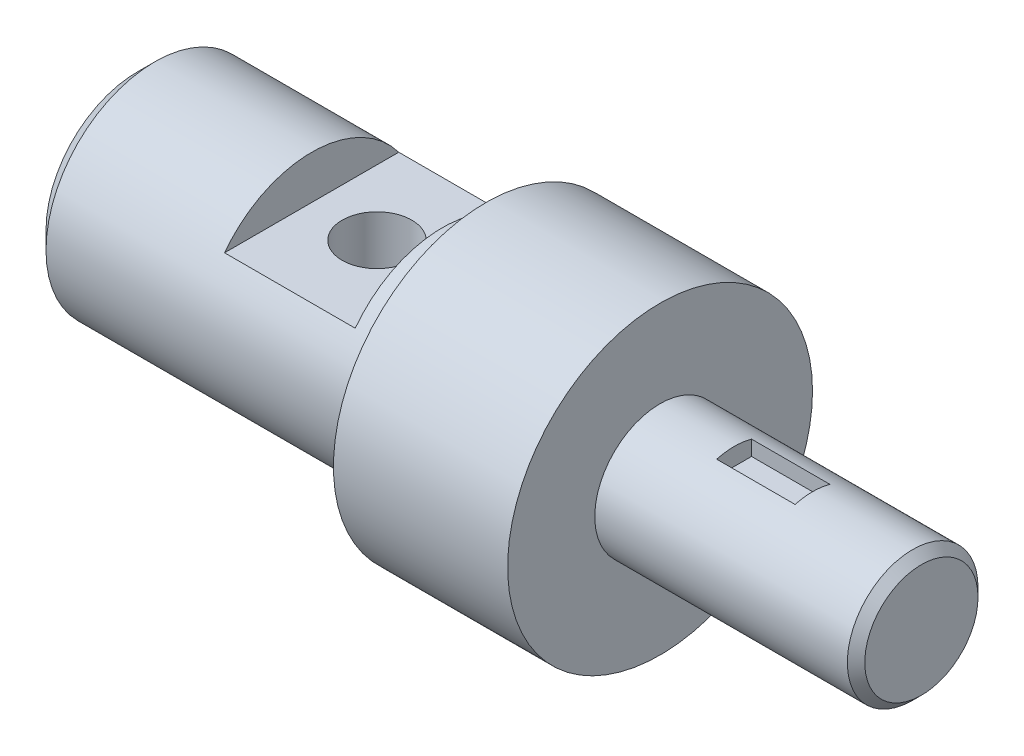
ISO-10303-21;
HEADER;
FILE_DESCRIPTION(('STEP AP214'),'2;1');
FILE_NAME('part.step','',(''),(''),'','','');
FILE_SCHEMA(('AUTOMOTIVE_DESIGN { 1 0 10303 214 1 1 1 1 }'));
ENDSEC;
DATA;
#1=APPLICATION_CONTEXT('core data for automotive mechanical design processes');
#2=APPLICATION_PROTOCOL_DEFINITION('international standard','automotive_design',2000,#1);
#3=PRODUCT_CONTEXT('',#1,'mechanical');
#4=PRODUCT('Part','Part','',(#3));
#5=PRODUCT_RELATED_PRODUCT_CATEGORY('part','',(#4));
#6=PRODUCT_DEFINITION_FORMATION('','',#4);
#7=PRODUCT_DEFINITION_CONTEXT('part definition',#1,'design');
#8=PRODUCT_DEFINITION('design','',#6,#7);
#9=PRODUCT_DEFINITION_SHAPE('','',#8);
#10=(LENGTH_UNIT() NAMED_UNIT(*) SI_UNIT(.MILLI.,.METRE.));
#11=(NAMED_UNIT(*) PLANE_ANGLE_UNIT() SI_UNIT($,.RADIAN.));
#12=(NAMED_UNIT(*) SI_UNIT($,.STERADIAN.) SOLID_ANGLE_UNIT());
#13=UNCERTAINTY_MEASURE_WITH_UNIT(LENGTH_MEASURE(1.E-05),#10,'distance_accuracy_value','');
#14=(GEOMETRIC_REPRESENTATION_CONTEXT(3) GLOBAL_UNCERTAINTY_ASSIGNED_CONTEXT((#13)) GLOBAL_UNIT_ASSIGNED_CONTEXT((#10,
#11,#12)) REPRESENTATION_CONTEXT('',''));
#15=CARTESIAN_POINT('',(0.,0.,0.));
#16=DIRECTION('',(0.,0.,1.));
#17=DIRECTION('',(1.,0.,0.));
#18=AXIS2_PLACEMENT_3D('',#15,#16,#17);
#19=CARTESIAN_POINT('',(0.,0.,0.));
#20=DIRECTION('',(-1.,0.,0.));
#21=DIRECTION('',(0.,0.,1.));
#22=AXIS2_PLACEMENT_3D('',#19,#20,#21);
#23=PLANE('',#22);
#24=CARTESIAN_POINT('',(0.,0.,0.));
#25=DIRECTION('',(-1.,0.,0.));
#26=DIRECTION('',(0.,0.,1.));
#27=AXIS2_PLACEMENT_3D('',#24,#25,#26);
#28=CIRCLE('',#27,21.);
#29=CARTESIAN_POINT('',(0.,0.,21.));
#30=VERTEX_POINT('',#29);
#31=EDGE_CURVE('E11',#30,#30,#28,.T.);
#32=ORIENTED_EDGE('',*,*,#31,.T.);
#33=EDGE_LOOP('',(#32));
#34=FACE_BOUND('',#33,.T.);
#35=ADVANCED_FACE('F33',(#34),#23,.T.);
#36=CARTESIAN_POINT('',(0.,0.,0.));
#37=DIRECTION('',(1.,0.,0.));
#38=DIRECTION('',(0.,0.,-1.));
#39=AXIS2_PLACEMENT_3D('',#36,#37,#38);
#40=CYLINDRICAL_SURFACE('',#39,25.);
#41=CARTESIAN_POINT('',(4.00000000000001,0.,0.));
#42=DIRECTION('',(-1.,0.,0.));
#43=DIRECTION('',(0.,0.,1.));
#44=AXIS2_PLACEMENT_3D('',#41,#42,#43);
#45=CIRCLE('',#44,25.);
#46=CARTESIAN_POINT('',(4.00000000000001,0.,25.));
#47=VERTEX_POINT('',#46);
#48=EDGE_CURVE('E41',#47,#47,#45,.F.);
#49=ORIENTED_EDGE('',*,*,#48,.T.);
#50=EDGE_LOOP('',(#49));
#51=FACE_BOUND('',#50,.T.);
#52=CARTESIAN_POINT('',(55.,-23.685438564654,8.00000000000001));
#53=CARTESIAN_POINT('',(54.7815803575144,-23.6854386808648,7.99999984957895));
#54=CARTESIAN_POINT('',(54.5631583241206,-23.6884680732668,7.99104739522468));
#55=CARTESIAN_POINT('',(54.1279420480163,-23.7004886386032,7.95532466127356));
#56=CARTESIAN_POINT('',(53.9111478298571,-23.7094799012743,7.92855411348258));
#57=CARTESIAN_POINT('',(53.4807765209476,-23.7331386878374,7.85745049211899));
#58=CARTESIAN_POINT('',(53.2671994309225,-23.7478062130085,7.81311741458832));
#59=CARTESIAN_POINT('',(52.8446965225023,-23.7823668675693,7.70727713375418));
#60=CARTESIAN_POINT('',(52.6357725455734,-23.8022620272859,7.64576325712626));
#61=CARTESIAN_POINT('',(52.2245298568912,-23.8466255896338,7.50625010454698));
#62=CARTESIAN_POINT('',(52.02219727758,-23.8710835495518,7.42828841980156));
#63=CARTESIAN_POINT('',(51.6249122191686,-23.9238870822497,7.25642411726833));
#64=CARTESIAN_POINT('',(51.4299625574611,-23.9522341204386,7.16251548746745));
#65=CARTESIAN_POINT('',(50.8581469336224,-24.0419138600675,6.85793629516375));
#66=CARTESIAN_POINT('',(50.493962319828,-24.1079252956509,6.62429224651448));
#67=CARTESIAN_POINT('',(49.7973644234584,-24.2476140916892,6.09348517787803));
#68=CARTESIAN_POINT('',(49.466378758206,-24.3214714988789,5.79449554928481));
#69=CARTESIAN_POINT('',(49.010501101048,-24.4305604336787,5.30805806180979));
#70=CARTESIAN_POINT('',(48.8652345031396,-24.4666614836583,5.13947531148956));
#71=CARTESIAN_POINT('',(48.5891239511144,-24.5373497989682,4.79062429786665));
#72=CARTESIAN_POINT('',(48.4582746042002,-24.5719376273827,4.61036044424485));
#73=CARTESIAN_POINT('',(48.2088922034705,-24.6394882013786,4.23472797296491));
#74=CARTESIAN_POINT('',(48.0907355340008,-24.6723910632087,4.03909881022464));
#75=CARTESIAN_POINT('',(47.8714280071339,-24.7347020758086,3.63808475977613));
#76=CARTESIAN_POINT('',(47.7702708731147,-24.7641115152498,3.43270350884649));
#77=CARTESIAN_POINT('',(47.5857545385277,-24.8186071657323,3.01353634546636));
#78=CARTESIAN_POINT('',(47.5023954108645,-24.8436933590644,2.79975039859258));
#79=CARTESIAN_POINT('',(47.3542239569391,-24.8888108707868,2.36532685435552));
#80=CARTESIAN_POINT('',(47.2894109035082,-24.9088423873611,2.14468952600255));
#81=CARTESIAN_POINT('',(47.180728925036,-24.9427027645633,1.70544007064569));
#82=CARTESIAN_POINT('',(47.1362519370392,-24.956710833976,1.48699212530629));
#83=CARTESIAN_POINT('',(47.0656605262099,-24.9790435892772,1.04686465468346));
#84=CARTESIAN_POINT('',(47.0395454311426,-24.9873684832283,0.825185248008188));
#85=CARTESIAN_POINT('',(47.0059330560568,-24.9980969713181,0.380320164500185));
#86=CARTESIAN_POINT('',(46.9984321156355,-25.0005017296283,0.157134792466881));
#87=CARTESIAN_POINT('',(47.0021118069011,-24.9993242178161,-0.289063657537331));
#88=CARTESIAN_POINT('',(47.0132920435224,-24.9957420743034,-0.512076739052016));
#89=CARTESIAN_POINT('',(47.0534758054651,-24.9829322363409,-0.948121459241208));
#90=CARTESIAN_POINT('',(47.0818155131301,-24.9739148611172,-1.16122085959996));
#91=CARTESIAN_POINT('',(47.1554934591184,-24.9506525224548,-1.5842429569984));
#92=CARTESIAN_POINT('',(47.2008373589439,-24.9364058179578,-1.79416457175747));
#93=CARTESIAN_POINT('',(47.3081123786972,-24.9030628614678,-2.20925418899823));
#94=CARTESIAN_POINT('',(47.3700381560653,-24.8839681715628,-2.41442369948073));
#95=CARTESIAN_POINT('',(47.5099985337709,-24.8414105650832,-2.81880756880318));
#96=CARTESIAN_POINT('',(47.588039204788,-24.8179460026514,-3.01801965093511));
#97=CARTESIAN_POINT('',(47.7606557370643,-24.7669381755912,-3.41154230115595));
#98=CARTESIAN_POINT('',(47.8554216336045,-24.7393486620652,-3.6057634723955));
#99=CARTESIAN_POINT('',(48.0601508039592,-24.681002406741,-3.98560664410535));
#100=CARTESIAN_POINT('',(48.170119284338,-24.6502445807863,-4.17122566931733));
#101=CARTESIAN_POINT('',(48.4044713517015,-24.5863436093405,-4.53270352451581));
#102=CARTESIAN_POINT('',(48.5288555731446,-24.5532003588876,-4.70856192441846));
#103=CARTESIAN_POINT('',(48.7912304060849,-24.4853581392628,-5.04950040506669));
#104=CARTESIAN_POINT('',(48.9292214723438,-24.4506591181159,-5.21458012526541));
#105=CARTESIAN_POINT('',(49.224294765057,-24.3790361534028,-5.53999615080865));
#106=CARTESIAN_POINT('',(49.3819484959968,-24.3420813307925,-5.69980789139332));
#107=CARTESIAN_POINT('',(49.7101016069825,-24.2684460367681,-6.00560235549347));
#108=CARTESIAN_POINT('',(49.8805969015458,-24.2317654821453,-6.15158944417049));
#109=CARTESIAN_POINT('',(50.233509153091,-24.1596686679399,-6.42891535142167));
#110=CARTESIAN_POINT('',(50.415932066845,-24.1242530539452,-6.56024676080871));
#111=CARTESIAN_POINT('',(50.7914143392303,-24.055729897642,-6.80722281220515));
#112=CARTESIAN_POINT('',(50.9844695103839,-24.0226214581356,-6.92287356873054));
#113=CARTESIAN_POINT('',(51.3825721713507,-23.9592714476214,-7.13905927828408));
#114=CARTESIAN_POINT('',(51.5877408210363,-23.9290716234423,-7.23938361928213));
#115=CARTESIAN_POINT('',(52.0063215593138,-23.8729789265058,-7.42226578397705));
#116=CARTESIAN_POINT('',(52.2197302130904,-23.8470842825312,-7.50483091821093));
#117=CARTESIAN_POINT('',(52.6533276958522,-23.800429138452,-7.65150322946081));
#118=CARTESIAN_POINT('',(52.8735158493688,-23.7796681287125,-7.71561223878846));
#119=CARTESIAN_POINT('',(53.3190300716208,-23.743975529647,-7.82476399336434));
#120=CARTESIAN_POINT('',(53.5443558995329,-23.7290436676779,-7.86980763035373));
#121=CARTESIAN_POINT('',(53.9888409338644,-23.7060174995229,-7.93889170576141));
#122=CARTESIAN_POINT('',(54.2078622710117,-23.697662621809,-7.96373400113701));
#123=CARTESIAN_POINT('',(54.6473536397787,-23.6870451499325,-7.99525936903906));
#124=CARTESIAN_POINT('',(54.8678236307973,-23.6847823857512,-8.00194294833893));
#125=CARTESIAN_POINT('',(55.3085057308031,-23.6864229191965,-7.99708539580729));
#126=CARTESIAN_POINT('',(55.5287178729785,-23.6903253090695,-7.98554694697623));
#127=CARTESIAN_POINT('',(55.9672481872955,-23.7041671395069,-7.94436471462869));
#128=CARTESIAN_POINT('',(56.185566379396,-23.7141065163736,-7.91472112214365));
#129=CARTESIAN_POINT('',(56.6119579936969,-23.7393032496007,-7.83881510596476));
#130=CARTESIAN_POINT('',(56.8201390515345,-23.7543859299533,-7.7930971836533));
#131=CARTESIAN_POINT('',(57.2318764618395,-23.7894762366902,-7.68531262760813));
#132=CARTESIAN_POINT('',(57.4354311436776,-23.8094856122303,-7.62324018687687));
#133=CARTESIAN_POINT('',(57.8364795153303,-23.8538445483664,-7.48328019357438));
#134=CARTESIAN_POINT('',(58.0339746556081,-23.878193060658,-7.40539646026721));
#135=CARTESIAN_POINT('',(58.4218204691984,-23.9305644078881,-7.23436820024294));
#136=CARTESIAN_POINT('',(58.612168399891,-23.9585886351545,-7.14121788732929));
#137=CARTESIAN_POINT('',(58.9900122130826,-24.0184175302227,-6.93737893981404));
#138=CARTESIAN_POINT('',(59.1772595043725,-24.0503091521117,-6.82625501208182));
#139=CARTESIAN_POINT('',(59.541870176719,-24.1163102267659,-6.58928737769674));
#140=CARTESIAN_POINT('',(59.719230112405,-24.1504204437669,-6.46343858673973));
#141=CARTESIAN_POINT('',(60.0629783261203,-24.219938268401,-6.19785668923714));
#142=CARTESIAN_POINT('',(60.2293658236983,-24.2553459680439,-6.05812259682144));
#143=CARTESIAN_POINT('',(60.5501889981145,-24.3265313336776,-5.76563306048303));
#144=CARTESIAN_POINT('',(60.7046244286207,-24.3623090072765,-5.6128773483211));
#145=CARTESIAN_POINT('',(61.0071453658597,-24.4348785274942,-5.28824824864535));
#146=CARTESIAN_POINT('',(61.1546520501366,-24.4716456851727,-5.11582929367889));
#147=CARTESIAN_POINT('',(61.4345900130402,-24.5435459979084,-4.75893573036775));
#148=CARTESIAN_POINT('',(61.5670263520449,-24.5786796990962,-4.57446520169249));
#149=CARTESIAN_POINT('',(61.8159796685336,-24.646363217685,-4.19452275928064));
#150=CARTESIAN_POINT('',(61.9324907444746,-24.6789120753393,-3.99904680486517));
#151=CARTESIAN_POINT('',(62.1485921125172,-24.7404858816269,-3.59852554329833));
#152=CARTESIAN_POINT('',(62.2481894527291,-24.7695122966486,-3.39348426773368));
#153=CARTESIAN_POINT('',(62.4290834785191,-24.8230510612467,-2.97657551943914));
#154=CARTESIAN_POINT('',(62.5104991135776,-24.8475925480298,-2.76476344195047));
#155=CARTESIAN_POINT('',(62.6551364957877,-24.8916927648829,-2.33459892745281));
#156=CARTESIAN_POINT('',(62.7183654471358,-24.9112534676118,-2.11624911815011));
#157=CARTESIAN_POINT('',(62.8260771739683,-24.9448363955662,-1.67456921077645));
#158=CARTESIAN_POINT('',(62.8705613544624,-24.9588590358908,-1.4512394872954));
#159=CARTESIAN_POINT('',(62.9403519065489,-24.9809545215066,-1.00131466158616));
#160=CARTESIAN_POINT('',(62.9656590262801,-24.9890275989028,-0.774719687093974));
#161=CARTESIAN_POINT('',(62.9961623768732,-24.9987683281904,-0.329977395751915));
#162=CARTESIAN_POINT('',(63.0021869382763,-25.0006997838081,-0.111892258699111));
#163=CARTESIAN_POINT('',(62.9964068589138,-24.9988502490425,0.324016073048192));
#164=CARTESIAN_POINT('',(62.9846025274623,-24.9950693577629,0.541839272221446));
#165=CARTESIAN_POINT('',(62.9432773332053,-24.9818989062369,0.975606985334868));
#166=CARTESIAN_POINT('',(62.9137578680302,-24.9725097884503,1.19155164611844));
#167=CARTESIAN_POINT('',(62.8372752895663,-24.9483780795732,1.62002344060835));
#168=CARTESIAN_POINT('',(62.7903121199832,-24.9336354712059,1.83255056328333));
#169=CARTESIAN_POINT('',(62.6801308987444,-24.8994319293148,2.24977742640648));
#170=CARTESIAN_POINT('',(62.6171475642325,-24.8800393414759,2.45454487231066));
#171=CARTESIAN_POINT('',(62.475118579292,-24.8369245375532,2.85803478911506));
#172=CARTESIAN_POINT('',(62.3960675544478,-24.8132008730564,3.056755211734));
#173=CARTESIAN_POINT('',(62.2225332612826,-24.7620297349124,3.44682151125832));
#174=CARTESIAN_POINT('',(62.1280509363013,-24.7345824889109,3.63816783807065));
#175=CARTESIAN_POINT('',(61.9243291578646,-24.6766448416532,4.0123624500628));
#176=CARTESIAN_POINT('',(61.8150887917887,-24.6461542522305,4.19521020876026));
#177=CARTESIAN_POINT('',(61.5785157983897,-24.5817710417011,4.55758428605791));
#178=CARTESIAN_POINT('',(61.4506835220378,-24.5477966714204,4.73676999619454));
#179=CARTESIAN_POINT('',(61.1808642675638,-24.4782780191123,5.08382063976728));
#180=CARTESIAN_POINT('',(61.0388770171924,-24.4427337068969,5.25168535535727));
#181=CARTESIAN_POINT('',(60.7416078750075,-24.3709920707552,5.57514131311731));
#182=CARTESIAN_POINT('',(60.5863220856443,-24.3347945578585,5.73072893125489));
#183=CARTESIAN_POINT('',(60.263442677397,-24.2627094461161,6.02863349136985));
#184=CARTESIAN_POINT('',(60.0958491973305,-24.2268218437801,6.17095058298368));
#185=CARTESIAN_POINT('',(59.7431926221287,-24.1550622480473,6.44623280732129));
#186=CARTESIAN_POINT('',(59.5577205645493,-24.1192360364833,6.57868658762253));
#187=CARTESIAN_POINT('',(59.1758986017667,-24.0500083393164,6.82742754976547));
#188=CARTESIAN_POINT('',(58.9795525498093,-24.0166060043738,6.9437204076819));
#189=CARTESIAN_POINT('',(58.5772254645046,-23.9532271614362,7.15929721420153));
#190=CARTESIAN_POINT('',(58.3712453803544,-23.9232503169413,7.25858283397506));
#191=CARTESIAN_POINT('',(57.9510447000177,-23.8676625416742,7.43933021995585));
#192=CARTESIAN_POINT('',(57.736824703956,-23.8420512936845,7.52079328132644));
#193=CARTESIAN_POINT('',(57.3171705108778,-23.7976656616538,7.66003007007605));
#194=CARTESIAN_POINT('',(57.1121956853139,-23.7785344826746,7.71907691819992));
#195=CARTESIAN_POINT('',(56.6978042823536,-23.7453132126206,7.82067534003812));
#196=CARTESIAN_POINT('',(56.4883880369382,-23.7312227461667,7.86322814207467));
#197=CARTESIAN_POINT('',(56.0665773948974,-23.7085058402604,7.93145930797294));
#198=CARTESIAN_POINT('',(55.8541836825504,-23.6998781657341,7.95714148613656));
#199=CARTESIAN_POINT('',(55.4278607698578,-23.6883444004375,7.99141211668505));
#200=CARTESIAN_POINT('',(55.2139315317591,-23.6854384508312,8.00000014733019));
#201=CARTESIAN_POINT('',(55.,-23.685438564654,8.00000000000001));
#202=B_SPLINE_CURVE_WITH_KNOTS('',3,(#52,#53,#54,#55,#56,#57,#58,#59,#60,#61,#62,#63,#64,#65,
#66,#67,#68,#69,#70,#71,#72,#73,#74,#75,#76,#77,#78,#79,#80,#81,#82,#83,#84,#85,#86,#87,#88,#89,
#90,#91,#92,#93,#94,#95,#96,#97,#98,#99,#100,#101,#102,#103,#104,#105,#106,#107,#108,#109,#110,
#111,#112,#113,#114,#115,#116,#117,#118,#119,#120,#121,#122,#123,#124,#125,#126,#127,#128,#129,
#130,#131,#132,#133,#134,#135,#136,#137,#138,#139,#140,#141,#142,#143,#144,#145,#146,#147,#148,
#149,#150,#151,#152,#153,#154,#155,#156,#157,#158,#159,#160,#161,#162,#163,#164,#165,#166,#167,
#168,#169,#170,#171,#172,#173,#174,#175,#176,#177,#178,#179,#180,#181,#182,#183,#184,#185,#186,
#187,#188,#189,#190,#191,#192,#193,#194,#195,#196,#197,#198,#199,#200,#201),.UNSPECIFIED.,.T.,
.F.,(4,2,2,2,2,2,2,2,2,2,2,2,2,2,2,2,2,2,2,2,2,2,2,2,2,2,2,2,2,2,2,2,2,2,2,2,2,2,2,2,2,2,2,2,2,
2,2,2,2,2,2,2,2,2,2,2,2,2,2,2,2,2,2,2,2,2,2,2,2,2,2,2,2,2,4),(0.,0.655059626466937,
1.31012911297413,1.96519874711431,2.62052317651381,3.27436579026311,3.92845545276964,
5.23552596387026,6.585320651651,7.26102103756146,7.93646781235462,8.62832191041121,
9.3199199959852,10.0115209144469,10.7030947123741,11.3723642470032,12.0416092781852,
12.7107226944427,13.379821960613,14.0245575199928,14.6695079332943,15.3142507978025,
15.9592369894635,16.6120885536783,17.2651642622509,17.9182687245846,18.5713950220844,
19.253131912357,19.9346528200399,20.6165167248811,21.2981139742046,21.9883670561084,
22.6783354507936,23.3682353222403,24.0581029215598,24.7190289456479,25.379936524424,
26.0407468006384,26.7015501046149,27.3418387875787,27.9823551248959,28.6227169273145,
29.2633219973532,29.9227705177049,30.5824474127847,31.2421711790877,31.9019085386744,
32.5906888581722,33.279237209635,33.9680400337648,34.6565551192825,35.3404244347918,
36.0240224784454,36.7075692740596,37.3910894016541,38.0448231841301,38.6985456250823,
39.3522164975664,40.0058894795917,40.6504875552268,41.2953015956814,41.9400762323772,
42.5848907594693,43.2522885730135,43.9196992254095,44.5873061570479,45.254905559941,
45.9462048365877,46.6372606965966,47.3282486128662,48.0191862984298,48.6609628012668,
49.3026915014081,49.944275062267,50.5858744518131),.UNSPECIFIED.);
#203=CARTESIAN_POINT('',(55.,-23.685438564654,8.00000000000001));
#204=VERTEX_POINT('',#203);
#205=EDGE_CURVE('E121',#204,#204,#202,.T.);
#206=ORIENTED_EDGE('',*,*,#205,.F.);
#207=EDGE_LOOP('',(#206));
#208=FACE_BOUND('',#207,.T.);
#209=DIRECTION('',(1.,0.,0.));
#210=VECTOR('',#209,1.);
#211=CARTESIAN_POINT('',(0.,15.,-20.));
#212=LINE('',#211,#210);
#213=CARTESIAN_POINT('',(70.,15.,-20.));
#214=VERTEX_POINT('',#213);
#215=CARTESIAN_POINT('',(40.,15.,-20.));
#216=VERTEX_POINT('',#215);
#217=EDGE_CURVE('E213',#214,#216,#212,.F.);
#218=ORIENTED_EDGE('',*,*,#217,.F.);
#219=CARTESIAN_POINT('',(70.,0.,0.));
#220=DIRECTION('',(1.,0.,0.));
#221=DIRECTION('',(0.,0.,-1.));
#222=AXIS2_PLACEMENT_3D('',#219,#220,#221);
#223=CIRCLE('',#222,25.);
#224=CARTESIAN_POINT('',(70.,15.,20.));
#225=VERTEX_POINT('',#224);
#226=EDGE_CURVE('E219',#225,#214,#223,.F.);
#227=ORIENTED_EDGE('',*,*,#226,.F.);
#228=DIRECTION('',(1.,0.,0.));
#229=VECTOR('',#228,1.);
#230=CARTESIAN_POINT('',(0.,15.,20.));
#231=LINE('',#230,#229);
#232=CARTESIAN_POINT('',(40.,15.,20.));
#233=VERTEX_POINT('',#232);
#234=EDGE_CURVE('E216',#233,#225,#231,.T.);
#235=ORIENTED_EDGE('',*,*,#234,.F.);
#236=CARTESIAN_POINT('',(40.,0.,0.));
#237=DIRECTION('',(-1.,0.,0.));
#238=DIRECTION('',(0.,0.,1.));
#239=AXIS2_PLACEMENT_3D('',#236,#237,#238);
#240=CIRCLE('',#239,25.);
#241=EDGE_CURVE('E227',#216,#233,#240,.F.);
#242=ORIENTED_EDGE('',*,*,#241,.F.);
#243=EDGE_LOOP('',(#218,#227,#235,#242));
#244=FACE_BOUND('',#243,.T.);
#245=CARTESIAN_POINT('',(80.,0.,0.));
#246=DIRECTION('',(1.,0.,0.));
#247=DIRECTION('',(0.,0.,-1.));
#248=AXIS2_PLACEMENT_3D('',#245,#246,#247);
#249=CIRCLE('',#248,25.);
#250=CARTESIAN_POINT('',(80.,0.,-25.));
#251=VERTEX_POINT('',#250);
#252=EDGE_CURVE('E215',#251,#251,#249,.T.);
#253=ORIENTED_EDGE('',*,*,#252,.F.);
#254=EDGE_LOOP('',(#253));
#255=FACE_BOUND('',#254,.T.);
#256=ADVANCED_FACE('F131',(#51,#208,#244,#255),#40,.T.);
#257=CARTESIAN_POINT('',(80.,25.,0.));
#258=DIRECTION('',(-1.,0.,0.));
#259=DIRECTION('',(0.,0.,1.));
#260=AXIS2_PLACEMENT_3D('',#257,#258,#259);
#261=PLANE('',#260);
#262=ORIENTED_EDGE('',*,*,#252,.T.);
#263=EDGE_LOOP('',(#262));
#264=FACE_BOUND('',#263,.T.);
#265=CARTESIAN_POINT('',(80.,0.,0.));
#266=DIRECTION('',(1.,0.,0.));
#267=DIRECTION('',(0.,0.,-1.));
#268=AXIS2_PLACEMENT_3D('',#265,#266,#267);
#269=CIRCLE('',#268,35.);
#270=CARTESIAN_POINT('',(80.,0.,-35.));
#271=VERTEX_POINT('',#270);
#272=EDGE_CURVE('E217',#271,#271,#269,.T.);
#273=ORIENTED_EDGE('',*,*,#272,.F.);
#274=EDGE_LOOP('',(#273));
#275=FACE_BOUND('',#274,.T.);
#276=ADVANCED_FACE('F168',(#264,#275),#261,.T.);
#277=CARTESIAN_POINT('',(0.,0.,0.));
#278=DIRECTION('',(1.,0.,0.));
#279=DIRECTION('',(0.,0.,-1.));
#280=AXIS2_PLACEMENT_3D('',#277,#278,#279);
#281=CYLINDRICAL_SURFACE('',#280,35.);
#282=ORIENTED_EDGE('',*,*,#272,.T.);
#283=EDGE_LOOP('',(#282));
#284=FACE_BOUND('',#283,.T.);
#285=CARTESIAN_POINT('',(120.,0.,0.));
#286=DIRECTION('',(1.,0.,0.));
#287=DIRECTION('',(0.,0.,-1.));
#288=AXIS2_PLACEMENT_3D('',#285,#286,#287);
#289=CIRCLE('',#288,35.);
#290=CARTESIAN_POINT('',(120.,0.,-35.));
#291=VERTEX_POINT('',#290);
#292=EDGE_CURVE('E222',#291,#291,#289,.T.);
#293=ORIENTED_EDGE('',*,*,#292,.F.);
#294=EDGE_LOOP('',(#293));
#295=FACE_BOUND('',#294,.T.);
#296=ADVANCED_FACE('F165',(#284,#295),#281,.T.);
#297=CARTESIAN_POINT('',(120.,35.,0.));
#298=DIRECTION('',(1.,0.,0.));
#299=DIRECTION('',(0.,0.,-1.));
#300=AXIS2_PLACEMENT_3D('',#297,#298,#299);
#301=PLANE('',#300);
#302=ORIENTED_EDGE('',*,*,#292,.T.);
#303=EDGE_LOOP('',(#302));
#304=FACE_BOUND('',#303,.T.);
#305=CARTESIAN_POINT('',(120.,0.,0.));
#306=DIRECTION('',(1.,0.,0.));
#307=DIRECTION('',(0.,0.,-1.));
#308=AXIS2_PLACEMENT_3D('',#305,#306,#307);
#309=CIRCLE('',#308,15.);
#310=CARTESIAN_POINT('',(120.,0.,-15.));
#311=VERTEX_POINT('',#310);
#312=EDGE_CURVE('E350',#311,#311,#309,.T.);
#313=ORIENTED_EDGE('',*,*,#312,.F.);
#314=EDGE_LOOP('',(#313));
#315=FACE_BOUND('',#314,.T.);
#316=ADVANCED_FACE('F161',(#304,#315),#301,.T.);
#317=CARTESIAN_POINT('',(0.,0.,0.));
#318=DIRECTION('',(1.,0.,0.));
#319=DIRECTION('',(0.,0.,-1.));
#320=AXIS2_PLACEMENT_3D('',#317,#318,#319);
#321=CYLINDRICAL_SURFACE('',#320,15.);
#322=CARTESIAN_POINT('',(178.,0.,0.));
#323=DIRECTION('',(1.,0.,0.));
#324=DIRECTION('',(0.,0.,-1.));
#325=AXIS2_PLACEMENT_3D('',#322,#323,#324);
#326=CIRCLE('',#325,15.);
#327=CARTESIAN_POINT('',(178.,0.,-15.));
#328=VERTEX_POINT('',#327);
#329=EDGE_CURVE('E195',#328,#328,#326,.F.);
#330=ORIENTED_EDGE('',*,*,#329,.T.);
#331=EDGE_LOOP('',(#330));
#332=FACE_BOUND('',#331,.T.);
#333=DIRECTION('',(1.,0.,0.));
#334=VECTOR('',#333,1.);
#335=CARTESIAN_POINT('',(0.,14.456832294801,-4.));
#336=LINE('',#335,#334);
#337=CARTESIAN_POINT('',(137.,14.456832294801,-4.));
#338=VERTEX_POINT('',#337);
#339=CARTESIAN_POINT('',(155.,14.456832294801,-4.));
#340=VERTEX_POINT('',#339);
#341=EDGE_CURVE('E95',#338,#340,#336,.T.);
#342=ORIENTED_EDGE('',*,*,#341,.T.);
#343=CARTESIAN_POINT('',(155.,0.,0.));
#344=DIRECTION('',(1.,0.,0.));
#345=DIRECTION('',(0.,0.,-1.));
#346=AXIS2_PLACEMENT_3D('',#343,#344,#345);
#347=CIRCLE('',#346,15.);
#348=CARTESIAN_POINT('',(155.,14.456832294801,4.));
#349=VERTEX_POINT('',#348);
#350=EDGE_CURVE('E232',#349,#340,#347,.F.);
#351=ORIENTED_EDGE('',*,*,#350,.F.);
#352=DIRECTION('',(1.,0.,0.));
#353=VECTOR('',#352,1.);
#354=CARTESIAN_POINT('',(0.,14.456832294801,4.));
#355=LINE('',#354,#353);
#356=CARTESIAN_POINT('',(137.,14.456832294801,4.));
#357=VERTEX_POINT('',#356);
#358=EDGE_CURVE('E230',#357,#349,#355,.T.);
#359=ORIENTED_EDGE('',*,*,#358,.F.);
#360=CARTESIAN_POINT('',(137.,0.,0.));
#361=DIRECTION('',(-1.,0.,0.));
#362=DIRECTION('',(0.,0.,1.));
#363=AXIS2_PLACEMENT_3D('',#360,#361,#362);
#364=CIRCLE('',#363,15.);
#365=EDGE_CURVE('E201',#338,#357,#364,.F.);
#366=ORIENTED_EDGE('',*,*,#365,.F.);
#367=EDGE_LOOP('',(#342,#351,#359,#366));
#368=FACE_BOUND('',#367,.T.);
#369=ORIENTED_EDGE('',*,*,#312,.T.);
#370=EDGE_LOOP('',(#369));
#371=FACE_BOUND('',#370,.T.);
#372=ADVANCED_FACE('F157',(#332,#368,#371),#321,.T.);
#373=CARTESIAN_POINT('',(180.,15.,0.));
#374=DIRECTION('',(1.,0.,0.));
#375=DIRECTION('',(0.,0.,-1.));
#376=AXIS2_PLACEMENT_3D('',#373,#374,#375);
#377=PLANE('',#376);
#378=CARTESIAN_POINT('',(180.,0.,0.));
#379=DIRECTION('',(1.,0.,0.));
#380=DIRECTION('',(0.,0.,-1.));
#381=AXIS2_PLACEMENT_3D('',#378,#379,#380);
#382=CIRCLE('',#381,13.);
#383=CARTESIAN_POINT('',(180.,0.,-13.));
#384=VERTEX_POINT('',#383);
#385=EDGE_CURVE('E198',#384,#384,#382,.T.);
#386=ORIENTED_EDGE('',*,*,#385,.T.);
#387=EDGE_LOOP('',(#386));
#388=FACE_BOUND('',#387,.T.);
#389=ADVANCED_FACE('F153',(#388),#377,.T.);
#390=CARTESIAN_POINT('',(40.,25.,-35.));
#391=DIRECTION('',(-1.,0.,0.));
#392=DIRECTION('',(0.,0.,1.));
#393=AXIS2_PLACEMENT_3D('',#390,#391,#392);
#394=PLANE('',#393);
#395=DIRECTION('',(0.,0.,1.));
#396=VECTOR('',#395,1.);
#397=CARTESIAN_POINT('',(40.,15.,-35.));
#398=LINE('',#397,#396);
#399=EDGE_CURVE('E56',#216,#233,#398,.T.);
#400=ORIENTED_EDGE('',*,*,#399,.F.);
#401=ORIENTED_EDGE('',*,*,#241,.T.);
#402=EDGE_LOOP('',(#400,#401));
#403=FACE_BOUND('',#402,.T.);
#404=ADVANCED_FACE('F146',(#403),#394,.F.);
#405=CARTESIAN_POINT('',(70.,25.,-35.));
#406=DIRECTION('',(1.,0.,0.));
#407=DIRECTION('',(0.,0.,-1.));
#408=AXIS2_PLACEMENT_3D('',#405,#406,#407);
#409=PLANE('',#408);
#410=ORIENTED_EDGE('',*,*,#226,.T.);
#411=DIRECTION('',(0.,0.,1.));
#412=VECTOR('',#411,1.);
#413=CARTESIAN_POINT('',(70.,15.,-35.));
#414=LINE('',#413,#412);
#415=EDGE_CURVE('E129',#214,#225,#414,.T.);
#416=ORIENTED_EDGE('',*,*,#415,.T.);
#417=EDGE_LOOP('',(#410,#416));
#418=FACE_BOUND('',#417,.T.);
#419=ADVANCED_FACE('F143',(#418),#409,.F.);
#420=CARTESIAN_POINT('',(40.,15.,-35.));
#421=DIRECTION('',(0.,-1.,0.));
#422=DIRECTION('',(0.,0.,-1.));
#423=AXIS2_PLACEMENT_3D('',#420,#421,#422);
#424=PLANE('',#423);
#425=CARTESIAN_POINT('',(55.,15.,0.));
#426=DIRECTION('',(0.,1.,0.));
#427=DIRECTION('',(0.,0.,1.));
#428=AXIS2_PLACEMENT_3D('',#425,#426,#427);
#429=CIRCLE('',#428,8.00000000000001);
#430=CARTESIAN_POINT('',(55.,15.,8.00000000000001));
#431=VERTEX_POINT('',#430);
#432=EDGE_CURVE('E117',#431,#431,#429,.T.);
#433=ORIENTED_EDGE('',*,*,#432,.F.);
#434=EDGE_LOOP('',(#433));
#435=FACE_BOUND('',#434,.T.);
#436=ORIENTED_EDGE('',*,*,#217,.T.);
#437=ORIENTED_EDGE('',*,*,#399,.T.);
#438=ORIENTED_EDGE('',*,*,#234,.T.);
#439=ORIENTED_EDGE('',*,*,#415,.F.);
#440=EDGE_LOOP('',(#436,#437,#438,#439));
#441=FACE_BOUND('',#440,.T.);
#442=ADVANCED_FACE('F140',(#435,#441),#424,.F.);
#443=CARTESIAN_POINT('',(55.,-35.,0.));
#444=DIRECTION('',(0.,1.,0.));
#445=DIRECTION('',(0.,0.,1.));
#446=AXIS2_PLACEMENT_3D('',#443,#444,#445);
#447=CYLINDRICAL_SURFACE('',#446,8.00000000000001);
#448=ORIENTED_EDGE('',*,*,#205,.T.);
#449=EDGE_LOOP('',(#448));
#450=FACE_BOUND('',#449,.T.);
#451=ORIENTED_EDGE('',*,*,#432,.T.);
#452=EDGE_LOOP('',(#451));
#453=FACE_BOUND('',#452,.T.);
#454=ADVANCED_FACE('F135',(#450,#453),#447,.F.);
#455=CARTESIAN_POINT('',(137.,15.,-4.));
#456=DIRECTION('',(-1.,0.,0.));
#457=DIRECTION('',(0.,0.,1.));
#458=AXIS2_PLACEMENT_3D('',#455,#456,#457);
#459=PLANE('',#458);
#460=DIRECTION('',(0.,-1.,0.));
#461=VECTOR('',#460,1.);
#462=CARTESIAN_POINT('',(137.,15.,-4.));
#463=LINE('',#462,#461);
#464=CARTESIAN_POINT('',(137.,11.,-4.));
#465=VERTEX_POINT('',#464);
#466=EDGE_CURVE('E88',#338,#465,#463,.T.);
#467=ORIENTED_EDGE('',*,*,#466,.F.);
#468=ORIENTED_EDGE('',*,*,#365,.T.);
#469=DIRECTION('',(0.,-1.,0.));
#470=VECTOR('',#469,1.);
#471=CARTESIAN_POINT('',(137.,15.,4.));
#472=LINE('',#471,#470);
#473=CARTESIAN_POINT('',(137.,11.,4.));
#474=VERTEX_POINT('',#473);
#475=EDGE_CURVE('E48',#357,#474,#472,.T.);
#476=ORIENTED_EDGE('',*,*,#475,.T.);
#477=DIRECTION('',(0.,0.,1.));
#478=VECTOR('',#477,1.);
#479=CARTESIAN_POINT('',(137.,11.,-4.));
#480=LINE('',#479,#478);
#481=EDGE_CURVE('E100',#465,#474,#480,.T.);
#482=ORIENTED_EDGE('',*,*,#481,.F.);
#483=EDGE_LOOP('',(#467,#468,#476,#482));
#484=FACE_BOUND('',#483,.T.);
#485=ADVANCED_FACE('F101',(#484),#459,.F.);
#486=CARTESIAN_POINT('',(155.,15.,-4.));
#487=DIRECTION('',(1.,0.,0.));
#488=DIRECTION('',(0.,0.,-1.));
#489=AXIS2_PLACEMENT_3D('',#486,#487,#488);
#490=PLANE('',#489);
#491=ORIENTED_EDGE('',*,*,#350,.T.);
#492=DIRECTION('',(0.,1.,0.));
#493=VECTOR('',#492,1.);
#494=CARTESIAN_POINT('',(155.,15.,-4.));
#495=LINE('',#494,#493);
#496=CARTESIAN_POINT('',(155.,11.,-4.));
#497=VERTEX_POINT('',#496);
#498=EDGE_CURVE('E105',#497,#340,#495,.T.);
#499=ORIENTED_EDGE('',*,*,#498,.F.);
#500=DIRECTION('',(0.,0.,1.));
#501=VECTOR('',#500,1.);
#502=CARTESIAN_POINT('',(155.,11.,-4.));
#503=LINE('',#502,#501);
#504=CARTESIAN_POINT('',(155.,11.,4.));
#505=VERTEX_POINT('',#504);
#506=EDGE_CURVE('E104',#497,#505,#503,.T.);
#507=ORIENTED_EDGE('',*,*,#506,.T.);
#508=DIRECTION('',(0.,1.,0.));
#509=VECTOR('',#508,1.);
#510=CARTESIAN_POINT('',(155.,15.,4.));
#511=LINE('',#510,#509);
#512=EDGE_CURVE('E97',#505,#349,#511,.T.);
#513=ORIENTED_EDGE('',*,*,#512,.T.);
#514=EDGE_LOOP('',(#491,#499,#507,#513));
#515=FACE_BOUND('',#514,.T.);
#516=ADVANCED_FACE('F239',(#515),#490,.F.);
#517=CARTESIAN_POINT('',(137.,11.,-4.));
#518=DIRECTION('',(0.,-1.,0.));
#519=DIRECTION('',(1.,0.,0.));
#520=AXIS2_PLACEMENT_3D('',#517,#518,#519);
#521=PLANE('',#520);
#522=DIRECTION('',(1.,0.,0.));
#523=VECTOR('',#522,1.);
#524=CARTESIAN_POINT('',(137.,11.,4.));
#525=LINE('',#524,#523);
#526=EDGE_CURVE('E113',#474,#505,#525,.T.);
#527=ORIENTED_EDGE('',*,*,#526,.T.);
#528=ORIENTED_EDGE('',*,*,#506,.F.);
#529=DIRECTION('',(1.,0.,0.));
#530=VECTOR('',#529,1.);
#531=CARTESIAN_POINT('',(137.,11.,-4.));
#532=LINE('',#531,#530);
#533=EDGE_CURVE('E93',#465,#497,#532,.T.);
#534=ORIENTED_EDGE('',*,*,#533,.F.);
#535=ORIENTED_EDGE('',*,*,#481,.T.);
#536=EDGE_LOOP('',(#527,#528,#534,#535));
#537=FACE_BOUND('',#536,.T.);
#538=ADVANCED_FACE('F107',(#537),#521,.F.);
#539=CARTESIAN_POINT('',(0.,0.,-4.));
#540=DIRECTION('',(0.,0.,1.));
#541=DIRECTION('',(1.,0.,0.));
#542=AXIS2_PLACEMENT_3D('',#539,#540,#541);
#543=PLANE('',#542);
#544=ORIENTED_EDGE('',*,*,#466,.T.);
#545=ORIENTED_EDGE('',*,*,#533,.T.);
#546=ORIENTED_EDGE('',*,*,#498,.T.);
#547=ORIENTED_EDGE('',*,*,#341,.F.);
#548=EDGE_LOOP('',(#544,#545,#546,#547));
#549=FACE_BOUND('',#548,.T.);
#550=ADVANCED_FACE('F90',(#549),#543,.T.);
#551=CARTESIAN_POINT('',(0.,0.,4.));
#552=DIRECTION('',(0.,0.,1.));
#553=DIRECTION('',(1.,0.,0.));
#554=AXIS2_PLACEMENT_3D('',#551,#552,#553);
#555=PLANE('',#554);
#556=ORIENTED_EDGE('',*,*,#358,.T.);
#557=ORIENTED_EDGE('',*,*,#512,.F.);
#558=ORIENTED_EDGE('',*,*,#526,.F.);
#559=ORIENTED_EDGE('',*,*,#475,.F.);
#560=EDGE_LOOP('',(#556,#557,#558,#559));
#561=FACE_BOUND('',#560,.T.);
#562=ADVANCED_FACE('F184',(#561),#555,.F.);
#563=CARTESIAN_POINT('',(180.,0.,0.));
#564=DIRECTION('',(-1.,0.,0.));
#565=DIRECTION('',(0.,0.,1.));
#566=AXIS2_PLACEMENT_3D('',#563,#564,#565);
#567=CONICAL_SURFACE('',#566,13.,0.785398163397452);
#568=ORIENTED_EDGE('',*,*,#329,.F.);
#569=EDGE_LOOP('',(#568));
#570=FACE_BOUND('',#569,.T.);
#571=ORIENTED_EDGE('',*,*,#385,.F.);
#572=EDGE_LOOP('',(#571));
#573=FACE_BOUND('',#572,.T.);
#574=ADVANCED_FACE('F182',(#570,#573),#567,.T.);
#575=CARTESIAN_POINT('',(4.00000000000001,0.,0.));
#576=DIRECTION('',(1.,0.,0.));
#577=DIRECTION('',(0.,0.,-1.));
#578=AXIS2_PLACEMENT_3D('',#575,#576,#577);
#579=CONICAL_SURFACE('',#578,25.,0.78539816339745);
#580=ORIENTED_EDGE('',*,*,#31,.F.);
#581=EDGE_LOOP('',(#580));
#582=FACE_BOUND('',#581,.T.);
#583=ORIENTED_EDGE('',*,*,#48,.F.);
#584=EDGE_LOOP('',(#583));
#585=FACE_BOUND('',#584,.T.);
#586=ADVANCED_FACE('F35',(#582,#585),#579,.T.);
#587=CLOSED_SHELL('',(#35,#256,#276,#296,#316,#372,#389,#404,#419,#442,#454,#485,#516,#538,#550,
#562,#574,#586));
#588=MANIFOLD_SOLID_BREP('B2',#587);
#589=ADVANCED_BREP_SHAPE_REPRESENTATION('',(#18,#588),#14);
#590=SHAPE_DEFINITION_REPRESENTATION(#9,#589);
ENDSEC;
END-ISO-10303-21;
